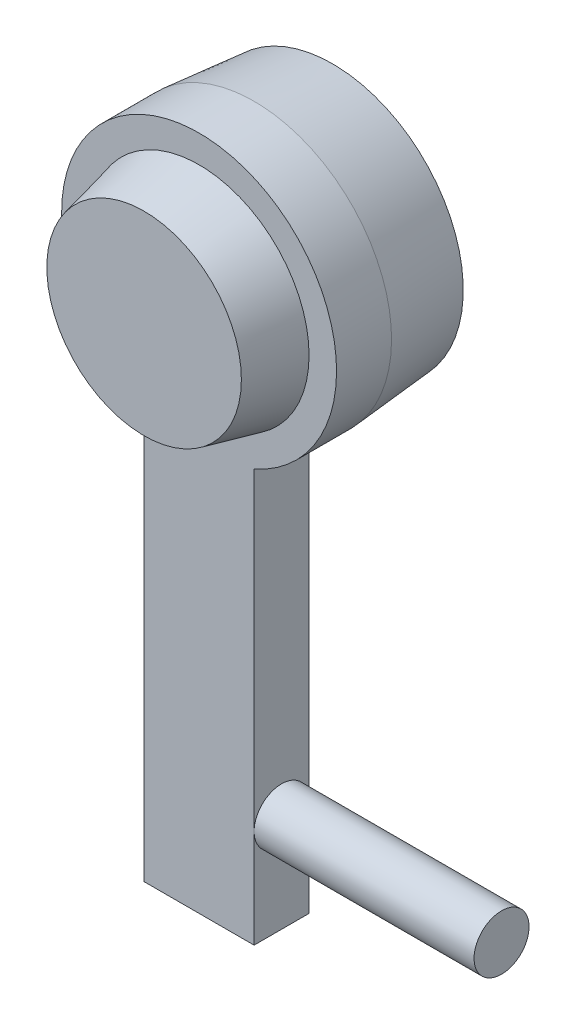
ISO-10303-21;
HEADER;
FILE_DESCRIPTION(('STEP AP214'),'2;1');
FILE_NAME('part.step','',(''),(''),'','','');
FILE_SCHEMA(('AUTOMOTIVE_DESIGN { 1 0 10303 214 1 1 1 1 }'));
ENDSEC;
DATA;
#1=APPLICATION_CONTEXT('core data for automotive mechanical design processes');
#2=APPLICATION_PROTOCOL_DEFINITION('international standard','automotive_design',2000,#1);
#3=PRODUCT_CONTEXT('',#1,'mechanical');
#4=PRODUCT('Part','Part','',(#3));
#5=PRODUCT_RELATED_PRODUCT_CATEGORY('part','',(#4));
#6=PRODUCT_DEFINITION_FORMATION('','',#4);
#7=PRODUCT_DEFINITION_CONTEXT('part definition',#1,'design');
#8=PRODUCT_DEFINITION('design','',#6,#7);
#9=PRODUCT_DEFINITION_SHAPE('','',#8);
#10=(LENGTH_UNIT() NAMED_UNIT(*) SI_UNIT(.MILLI.,.METRE.));
#11=(NAMED_UNIT(*) PLANE_ANGLE_UNIT() SI_UNIT($,.RADIAN.));
#12=(NAMED_UNIT(*) SI_UNIT($,.STERADIAN.) SOLID_ANGLE_UNIT());
#13=UNCERTAINTY_MEASURE_WITH_UNIT(LENGTH_MEASURE(1.E-05),#10,'distance_accuracy_value','');
#14=(GEOMETRIC_REPRESENTATION_CONTEXT(3) GLOBAL_UNCERTAINTY_ASSIGNED_CONTEXT((#13)) GLOBAL_UNIT_ASSIGNED_CONTEXT((#10,
#11,#12)) REPRESENTATION_CONTEXT('',''));
#15=CARTESIAN_POINT('',(0.,0.,0.));
#16=DIRECTION('',(0.,0.,1.));
#17=DIRECTION('',(1.,0.,0.));
#18=AXIS2_PLACEMENT_3D('',#15,#16,#17);
#19=CARTESIAN_POINT('',(10.,-22.9128784747792,5.));
#20=DIRECTION('',(-1.,0.,0.));
#21=DIRECTION('',(0.,-1.,0.));
#22=AXIS2_PLACEMENT_3D('',#19,#20,#21);
#23=PLANE('',#22);
#24=CARTESIAN_POINT('',(10.,-80.,0.));
#25=DIRECTION('',(1.,0.,0.));
#26=DIRECTION('',(0.,1.,0.));
#27=AXIS2_PLACEMENT_3D('',#24,#25,#26);
#28=CIRCLE('',#27,5.);
#29=CARTESIAN_POINT('',(10.,-80.,-5.));
#30=VERTEX_POINT('',#29);
#31=CARTESIAN_POINT('',(10.,-80.,5.));
#32=VERTEX_POINT('',#31);
#33=EDGE_CURVE('E109',#30,#32,#28,.T.);
#34=ORIENTED_EDGE('',*,*,#33,.F.);
#35=DIRECTION('',(0.,1.,0.));
#36=VECTOR('',#35,1.);
#37=CARTESIAN_POINT('',(10.,-22.9128784747792,-5.));
#38=LINE('',#37,#36);
#39=CARTESIAN_POINT('',(10.,-22.9128784747792,-5.));
#40=VERTEX_POINT('',#39);
#41=EDGE_CURVE('E98',#30,#40,#38,.T.);
#42=ORIENTED_EDGE('',*,*,#41,.T.);
#43=DIRECTION('',(0.,0.,-1.));
#44=VECTOR('',#43,1.);
#45=CARTESIAN_POINT('',(10.,-22.9128784747792,5.));
#46=LINE('',#45,#44);
#47=CARTESIAN_POINT('',(10.,-22.9128784747792,5.));
#48=VERTEX_POINT('',#47);
#49=EDGE_CURVE('E134',#48,#40,#46,.T.);
#50=ORIENTED_EDGE('',*,*,#49,.F.);
#51=DIRECTION('',(0.,1.,0.));
#52=VECTOR('',#51,1.);
#53=CARTESIAN_POINT('',(10.,-22.9128784747792,5.));
#54=LINE('',#53,#52);
#55=EDGE_CURVE('E58',#32,#48,#54,.T.);
#56=ORIENTED_EDGE('',*,*,#55,.F.);
#57=EDGE_LOOP('',(#34,#42,#50,#56));
#58=FACE_BOUND('',#57,.T.);
#59=ADVANCED_FACE('F34',(#58),#23,.F.);
#60=CARTESIAN_POINT('',(0.,0.,5.));
#61=DIRECTION('',(0.,0.,-1.));
#62=DIRECTION('',(-1.,0.,0.));
#63=AXIS2_PLACEMENT_3D('',#60,#61,#62);
#64=CYLINDRICAL_SURFACE('',#63,25.);
#65=CARTESIAN_POINT('',(0.,0.,-5.));
#66=DIRECTION('',(0.,0.,1.));
#67=DIRECTION('',(1.,0.,0.));
#68=AXIS2_PLACEMENT_3D('',#65,#66,#67);
#69=CIRCLE('',#68,25.);
#70=CARTESIAN_POINT('',(-10.,-22.9128784747792,-5.));
#71=VERTEX_POINT('',#70);
#72=EDGE_CURVE('E127',#40,#71,#69,.T.);
#73=ORIENTED_EDGE('',*,*,#72,.T.);
#74=DIRECTION('',(0.,0.,-1.));
#75=VECTOR('',#74,1.);
#76=CARTESIAN_POINT('',(-10.,-22.9128784747792,5.));
#77=LINE('',#76,#75);
#78=CARTESIAN_POINT('',(-10.,-22.9128784747792,5.));
#79=VERTEX_POINT('',#78);
#80=EDGE_CURVE('E38',#79,#71,#77,.T.);
#81=ORIENTED_EDGE('',*,*,#80,.F.);
#82=CARTESIAN_POINT('',(0.,0.,5.));
#83=DIRECTION('',(0.,0.,1.));
#84=DIRECTION('',(1.,0.,0.));
#85=AXIS2_PLACEMENT_3D('',#82,#83,#84);
#86=CIRCLE('',#85,25.);
#87=EDGE_CURVE('E97',#48,#79,#86,.T.);
#88=ORIENTED_EDGE('',*,*,#87,.F.);
#89=ORIENTED_EDGE('',*,*,#49,.T.);
#90=EDGE_LOOP('',(#73,#81,#88,#89));
#91=FACE_BOUND('',#90,.T.);
#92=ADVANCED_FACE('F36',(#91),#64,.T.);
#93=CARTESIAN_POINT('',(-10.,-22.9128784747792,5.));
#94=DIRECTION('',(1.,0.,0.));
#95=DIRECTION('',(0.,1.,0.));
#96=AXIS2_PLACEMENT_3D('',#93,#94,#95);
#97=PLANE('',#96);
#98=DIRECTION('',(0.,-1.,0.));
#99=VECTOR('',#98,1.);
#100=CARTESIAN_POINT('',(-10.,-22.9128784747792,-5.));
#101=LINE('',#100,#99);
#102=CARTESIAN_POINT('',(-9.99999999999999,-97.9128784747792,-5.));
#103=VERTEX_POINT('',#102);
#104=EDGE_CURVE('E137',#71,#103,#101,.T.);
#105=ORIENTED_EDGE('',*,*,#104,.T.);
#106=DIRECTION('',(0.,0.,-1.));
#107=VECTOR('',#106,1.);
#108=CARTESIAN_POINT('',(-9.99999999999999,-97.9128784747792,5.));
#109=LINE('',#108,#107);
#110=CARTESIAN_POINT('',(-9.99999999999999,-97.9128784747792,5.));
#111=VERTEX_POINT('',#110);
#112=EDGE_CURVE('E141',#111,#103,#109,.T.);
#113=ORIENTED_EDGE('',*,*,#112,.F.);
#114=DIRECTION('',(0.,-1.,0.));
#115=VECTOR('',#114,1.);
#116=CARTESIAN_POINT('',(-10.,-22.9128784747792,5.));
#117=LINE('',#116,#115);
#118=EDGE_CURVE('E86',#79,#111,#117,.T.);
#119=ORIENTED_EDGE('',*,*,#118,.F.);
#120=ORIENTED_EDGE('',*,*,#80,.T.);
#121=EDGE_LOOP('',(#105,#113,#119,#120));
#122=FACE_BOUND('',#121,.T.);
#123=ADVANCED_FACE('F144',(#122),#97,.F.);
#124=CARTESIAN_POINT('',(-9.99999999999999,-97.9128784747792,5.));
#125=DIRECTION('',(0.,1.,0.));
#126=DIRECTION('',(0.,0.,1.));
#127=AXIS2_PLACEMENT_3D('',#124,#125,#126);
#128=PLANE('',#127);
#129=DIRECTION('',(1.,0.,0.));
#130=VECTOR('',#129,1.);
#131=CARTESIAN_POINT('',(-9.99999999999999,-97.9128784747792,-5.));
#132=LINE('',#131,#130);
#133=CARTESIAN_POINT('',(10.,-97.9128784747792,-5.));
#134=VERTEX_POINT('',#133);
#135=EDGE_CURVE('E78',#103,#134,#132,.T.);
#136=ORIENTED_EDGE('',*,*,#135,.T.);
#137=DIRECTION('',(0.,0.,-1.));
#138=VECTOR('',#137,1.);
#139=CARTESIAN_POINT('',(10.,-97.9128784747792,5.));
#140=LINE('',#139,#138);
#141=CARTESIAN_POINT('',(10.,-97.9128784747792,5.));
#142=VERTEX_POINT('',#141);
#143=EDGE_CURVE('E95',#142,#134,#140,.T.);
#144=ORIENTED_EDGE('',*,*,#143,.F.);
#145=DIRECTION('',(1.,0.,0.));
#146=VECTOR('',#145,1.);
#147=CARTESIAN_POINT('',(-9.99999999999999,-97.9128784747792,5.));
#148=LINE('',#147,#146);
#149=EDGE_CURVE('E130',#111,#142,#148,.T.);
#150=ORIENTED_EDGE('',*,*,#149,.F.);
#151=ORIENTED_EDGE('',*,*,#112,.T.);
#152=EDGE_LOOP('',(#136,#144,#150,#151));
#153=FACE_BOUND('',#152,.T.);
#154=ADVANCED_FACE('F173',(#153),#128,.F.);
#155=EDGE_CURVE('E50',#32,#30,#28,.T.);
#156=ORIENTED_EDGE('',*,*,#155,.F.);
#157=EDGE_CURVE('E132',#142,#32,#54,.T.);
#158=ORIENTED_EDGE('',*,*,#157,.F.);
#159=ORIENTED_EDGE('',*,*,#143,.T.);
#160=EDGE_CURVE('E92',#134,#30,#38,.T.);
#161=ORIENTED_EDGE('',*,*,#160,.T.);
#162=EDGE_LOOP('',(#156,#158,#159,#161));
#163=FACE_BOUND('',#162,.T.);
#164=ADVANCED_FACE('F94',(#163),#23,.F.);
#165=CARTESIAN_POINT('',(0.,0.,5.));
#166=DIRECTION('',(0.,0.,1.));
#167=DIRECTION('',(1.,0.,0.));
#168=AXIS2_PLACEMENT_3D('',#165,#166,#167);
#169=PLANE('',#168);
#170=CARTESIAN_POINT('',(0.,0.,5.));
#171=DIRECTION('',(0.,0.,1.));
#172=DIRECTION('',(1.,0.,0.));
#173=AXIS2_PLACEMENT_3D('',#170,#171,#172);
#174=CIRCLE('',#173,20.);
#175=CARTESIAN_POINT('',(20.,0.,5.));
#176=VERTEX_POINT('',#175);
#177=EDGE_CURVE('E11',#176,#176,#174,.T.);
#178=ORIENTED_EDGE('',*,*,#177,.F.);
#179=EDGE_LOOP('',(#178));
#180=FACE_BOUND('',#179,.T.);
#181=ORIENTED_EDGE('',*,*,#87,.T.);
#182=ORIENTED_EDGE('',*,*,#118,.T.);
#183=ORIENTED_EDGE('',*,*,#149,.T.);
#184=ORIENTED_EDGE('',*,*,#157,.T.);
#185=ORIENTED_EDGE('',*,*,#55,.T.);
#186=EDGE_LOOP('',(#181,#182,#183,#184,#185));
#187=FACE_BOUND('',#186,.T.);
#188=ADVANCED_FACE('F172',(#180,#187),#169,.T.);
#189=CARTESIAN_POINT('',(0.,0.,-5.));
#190=DIRECTION('',(0.,0.,1.));
#191=DIRECTION('',(1.,0.,0.));
#192=AXIS2_PLACEMENT_3D('',#189,#190,#191);
#193=PLANE('',#192);
#194=CARTESIAN_POINT('',(0.,0.,-5.));
#195=DIRECTION('',(0.,0.,-1.));
#196=DIRECTION('',(-1.,0.,0.));
#197=AXIS2_PLACEMENT_3D('',#194,#195,#196);
#198=CIRCLE('',#197,25.);
#199=EDGE_CURVE('E104',#40,#71,#198,.T.);
#200=ORIENTED_EDGE('',*,*,#199,.F.);
#201=ORIENTED_EDGE('',*,*,#41,.F.);
#202=ORIENTED_EDGE('',*,*,#160,.F.);
#203=ORIENTED_EDGE('',*,*,#135,.F.);
#204=ORIENTED_EDGE('',*,*,#104,.F.);
#205=EDGE_LOOP('',(#200,#201,#202,#203,#204));
#206=FACE_BOUND('',#205,.T.);
#207=ADVANCED_FACE('F102',(#206),#193,.F.);
#208=CARTESIAN_POINT('',(0.,0.,5.));
#209=DIRECTION('',(0.,0.,-1.));
#210=DIRECTION('',(1.,0.,0.));
#211=AXIS2_PLACEMENT_3D('',#208,#209,#210);
#212=CONICAL_SURFACE('',#211,20.,0.226892802759263);
#213=CARTESIAN_POINT('',(0.,0.,15.));
#214=DIRECTION('',(0.,0.,1.));
#215=DIRECTION('',(1.,0.,0.));
#216=AXIS2_PLACEMENT_3D('',#213,#214,#215);
#217=CIRCLE('',#216,17.6913180887444);
#218=CARTESIAN_POINT('',(17.6913180887444,0.,15.));
#219=VERTEX_POINT('',#218);
#220=EDGE_CURVE('E123',#219,#219,#217,.T.);
#221=ORIENTED_EDGE('',*,*,#220,.F.);
#222=EDGE_LOOP('',(#221));
#223=FACE_BOUND('',#222,.T.);
#224=ORIENTED_EDGE('',*,*,#177,.T.);
#225=EDGE_LOOP('',(#224));
#226=FACE_BOUND('',#225,.T.);
#227=ADVANCED_FACE('F199',(#223,#226),#212,.T.);
#228=CARTESIAN_POINT('',(0.,0.,15.));
#229=DIRECTION('',(0.,0.,1.));
#230=DIRECTION('',(1.,0.,0.));
#231=AXIS2_PLACEMENT_3D('',#228,#229,#230);
#232=PLANE('',#231);
#233=ORIENTED_EDGE('',*,*,#220,.T.);
#234=EDGE_LOOP('',(#233));
#235=FACE_BOUND('',#234,.T.);
#236=ADVANCED_FACE('F160',(#235),#232,.T.);
#237=CARTESIAN_POINT('',(0.,0.,-5.));
#238=DIRECTION('',(0.,0.,-1.));
#239=DIRECTION('',(-1.,0.,0.));
#240=AXIS2_PLACEMENT_3D('',#237,#238,#239);
#241=CONICAL_SURFACE('',#240,22.5,0.0872664625997167);
#242=CARTESIAN_POINT('',(0.,0.,-5.));
#243=DIRECTION('',(0.,0.,-1.));
#244=DIRECTION('',(-1.,0.,0.));
#245=AXIS2_PLACEMENT_3D('',#242,#243,#244);
#246=CIRCLE('',#245,22.5);
#247=CARTESIAN_POINT('',(-22.5,0.,-5.));
#248=VERTEX_POINT('',#247);
#249=EDGE_CURVE('E115',#248,#248,#246,.T.);
#250=ORIENTED_EDGE('',*,*,#249,.F.);
#251=EDGE_LOOP('',(#250));
#252=FACE_BOUND('',#251,.T.);
#253=CARTESIAN_POINT('',(0.,0.,-19.2875653784517));
#254=DIRECTION('',(0.,0.,-1.));
#255=DIRECTION('',(-1.,0.,0.));
#256=AXIS2_PLACEMENT_3D('',#253,#254,#255);
#257=CIRCLE('',#256,23.75);
#258=CARTESIAN_POINT('',(-23.75,0.,-19.2875653784517));
#259=VERTEX_POINT('',#258);
#260=EDGE_CURVE('E121',#259,#259,#257,.T.);
#261=ORIENTED_EDGE('',*,*,#260,.T.);
#262=EDGE_LOOP('',(#261));
#263=FACE_BOUND('',#262,.T.);
#264=ADVANCED_FACE('F151',(#252,#263),#241,.F.);
#265=CARTESIAN_POINT('',(0.,0.,-5.));
#266=DIRECTION('',(0.,0.,1.));
#267=DIRECTION('',(-1.,0.,0.));
#268=AXIS2_PLACEMENT_3D('',#265,#266,#267);
#269=CONICAL_SURFACE('',#268,25.,0.0872664625997167);
#270=ORIENTED_EDGE('',*,*,#260,.F.);
#271=EDGE_LOOP('',(#270));
#272=FACE_BOUND('',#271,.T.);
#273=ORIENTED_EDGE('',*,*,#199,.T.);
#274=ORIENTED_EDGE('',*,*,#72,.F.);
#275=EDGE_LOOP('',(#273,#274));
#276=FACE_BOUND('',#275,.T.);
#277=ADVANCED_FACE('F148',(#272,#276),#269,.T.);
#278=ORIENTED_EDGE('',*,*,#249,.T.);
#279=EDGE_LOOP('',(#278));
#280=FACE_BOUND('',#279,.T.);
#281=ADVANCED_FACE('F150',(#280),#193,.F.);
#282=CARTESIAN_POINT('',(50.,-80.,0.));
#283=DIRECTION('',(-1.,0.,0.));
#284=DIRECTION('',(0.,-1.,0.));
#285=AXIS2_PLACEMENT_3D('',#282,#283,#284);
#286=CYLINDRICAL_SURFACE('',#285,5.);
#287=CARTESIAN_POINT('',(50.,-80.,0.));
#288=DIRECTION('',(1.,0.,0.));
#289=DIRECTION('',(0.,1.,0.));
#290=AXIS2_PLACEMENT_3D('',#287,#288,#289);
#291=CIRCLE('',#290,5.);
#292=CARTESIAN_POINT('',(50.,-75.,0.));
#293=VERTEX_POINT('',#292);
#294=EDGE_CURVE('E113',#293,#293,#291,.T.);
#295=ORIENTED_EDGE('',*,*,#294,.F.);
#296=EDGE_LOOP('',(#295));
#297=FACE_BOUND('',#296,.T.);
#298=ORIENTED_EDGE('',*,*,#155,.T.);
#299=ORIENTED_EDGE('',*,*,#33,.T.);
#300=EDGE_LOOP('',(#298,#299));
#301=FACE_BOUND('',#300,.T.);
#302=ADVANCED_FACE('F112',(#297,#301),#286,.T.);
#303=CARTESIAN_POINT('',(50.,-80.,0.));
#304=DIRECTION('',(1.,0.,0.));
#305=DIRECTION('',(0.,1.,0.));
#306=AXIS2_PLACEMENT_3D('',#303,#304,#305);
#307=PLANE('',#306);
#308=ORIENTED_EDGE('',*,*,#294,.T.);
#309=EDGE_LOOP('',(#308));
#310=FACE_BOUND('',#309,.T.);
#311=ADVANCED_FACE('F241',(#310),#307,.T.);
#312=CLOSED_SHELL('',(#59,#92,#123,#154,#164,#188,#207,#227,#236,#264,#277,#281,#302,#311));
#313=MANIFOLD_SOLID_BREP('B2',#312);
#314=ADVANCED_BREP_SHAPE_REPRESENTATION('',(#18,#313),#14);
#315=SHAPE_DEFINITION_REPRESENTATION(#9,#314);
ENDSEC;
END-ISO-10303-21;
